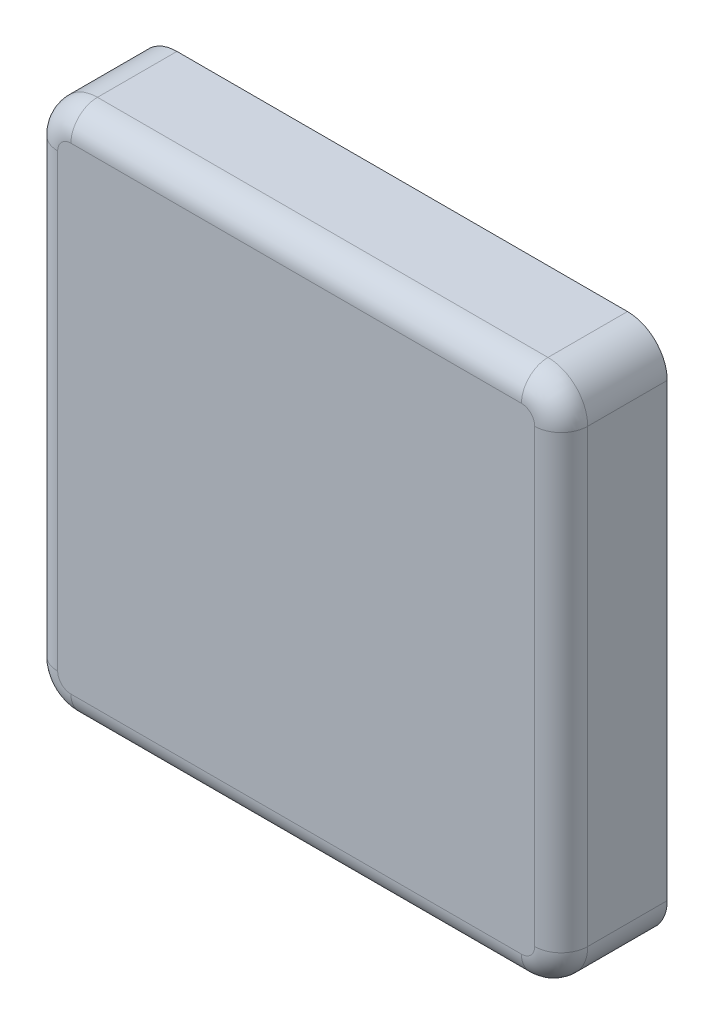
ISO-10303-21;
HEADER;
FILE_DESCRIPTION(('STEP AP214'),'2;1');
FILE_NAME('part.step','',(''),(''),'','','');
FILE_SCHEMA(('AUTOMOTIVE_DESIGN { 1 0 10303 214 1 1 1 1 }'));
ENDSEC;
DATA;
#1=APPLICATION_CONTEXT('core data for automotive mechanical design processes');
#2=APPLICATION_PROTOCOL_DEFINITION('international standard','automotive_design',2000,#1);
#3=PRODUCT_CONTEXT('',#1,'mechanical');
#4=PRODUCT('Part','Part','',(#3));
#5=PRODUCT_RELATED_PRODUCT_CATEGORY('part','',(#4));
#6=PRODUCT_DEFINITION_FORMATION('','',#4);
#7=PRODUCT_DEFINITION_CONTEXT('part definition',#1,'design');
#8=PRODUCT_DEFINITION('design','',#6,#7);
#9=PRODUCT_DEFINITION_SHAPE('','',#8);
#10=(LENGTH_UNIT() NAMED_UNIT(*) SI_UNIT(.MILLI.,.METRE.));
#11=(NAMED_UNIT(*) PLANE_ANGLE_UNIT() SI_UNIT($,.RADIAN.));
#12=(NAMED_UNIT(*) SI_UNIT($,.STERADIAN.) SOLID_ANGLE_UNIT());
#13=UNCERTAINTY_MEASURE_WITH_UNIT(LENGTH_MEASURE(1.E-05),#10,'distance_accuracy_value','');
#14=(GEOMETRIC_REPRESENTATION_CONTEXT(3) GLOBAL_UNCERTAINTY_ASSIGNED_CONTEXT((#13)) GLOBAL_UNIT_ASSIGNED_CONTEXT((#10,
#11,#12)) REPRESENTATION_CONTEXT('',''));
#15=CARTESIAN_POINT('',(0.,0.,0.));
#16=DIRECTION('',(0.,0.,1.));
#17=DIRECTION('',(1.,0.,0.));
#18=AXIS2_PLACEMENT_3D('',#15,#16,#17);
#19=CARTESIAN_POINT('',(0.,0.,0.));
#20=DIRECTION('',(0.,0.,1.));
#21=DIRECTION('',(1.,0.,0.));
#22=AXIS2_PLACEMENT_3D('',#19,#20,#21);
#23=PLANE('',#22);
#24=CARTESIAN_POINT('',(0.,0.,0.));
#25=DIRECTION('',(0.,0.,1.));
#26=DIRECTION('',(1.,0.,0.));
#27=AXIS2_PLACEMENT_3D('',#24,#25,#26);
#28=CIRCLE('',#27,4.5);
#29=CARTESIAN_POINT('',(4.5,0.,0.));
#30=VERTEX_POINT('',#29);
#31=EDGE_CURVE('E399',#30,#30,#28,.T.);
#32=ORIENTED_EDGE('',*,*,#31,.F.);
#33=EDGE_LOOP('',(#32));
#34=FACE_BOUND('',#33,.T.);
#35=DIRECTION('',(0.,1.,0.));
#36=VECTOR('',#35,1.);
#37=CARTESIAN_POINT('',(1.6,-1.6,0.));
#38=LINE('',#37,#36);
#39=CARTESIAN_POINT('',(1.6,-1.6,0.));
#40=VERTEX_POINT('',#39);
#41=CARTESIAN_POINT('',(1.6,1.6,0.));
#42=VERTEX_POINT('',#41);
#43=EDGE_CURVE('E353',#40,#42,#38,.T.);
#44=ORIENTED_EDGE('',*,*,#43,.T.);
#45=DIRECTION('',(-1.,0.,0.));
#46=VECTOR('',#45,1.);
#47=CARTESIAN_POINT('',(-1.6,1.6,0.));
#48=LINE('',#47,#46);
#49=CARTESIAN_POINT('',(-1.6,1.6,0.));
#50=VERTEX_POINT('',#49);
#51=EDGE_CURVE('E375',#42,#50,#48,.T.);
#52=ORIENTED_EDGE('',*,*,#51,.T.);
#53=DIRECTION('',(0.,-1.,0.));
#54=VECTOR('',#53,1.);
#55=CARTESIAN_POINT('',(-1.6,-1.6,0.));
#56=LINE('',#55,#54);
#57=CARTESIAN_POINT('',(-1.6,-1.6,0.));
#58=VERTEX_POINT('',#57);
#59=EDGE_CURVE('E379',#50,#58,#56,.T.);
#60=ORIENTED_EDGE('',*,*,#59,.T.);
#61=DIRECTION('',(1.,0.,0.));
#62=VECTOR('',#61,1.);
#63=CARTESIAN_POINT('',(-1.6,-1.6,0.));
#64=LINE('',#63,#62);
#65=EDGE_CURVE('E359',#58,#40,#64,.T.);
#66=ORIENTED_EDGE('',*,*,#65,.T.);
#67=EDGE_LOOP('',(#44,#52,#60,#66));
#68=FACE_BOUND('',#67,.T.);
#69=ADVANCED_FACE('F39',(#34,#68),#23,.F.);
#70=CARTESIAN_POINT('',(0.,0.,5.1));
#71=DIRECTION('',(0.,0.,-1.));
#72=DIRECTION('',(-1.,0.,0.));
#73=AXIS2_PLACEMENT_3D('',#70,#71,#72);
#74=CYLINDRICAL_SURFACE('',#73,4.5);
#75=CARTESIAN_POINT('',(0.,0.,5.1));
#76=DIRECTION('',(0.,0.,1.));
#77=DIRECTION('',(1.,0.,0.));
#78=AXIS2_PLACEMENT_3D('',#75,#76,#77);
#79=CIRCLE('',#78,4.5);
#80=CARTESIAN_POINT('',(4.5,0.,5.1));
#81=VERTEX_POINT('',#80);
#82=EDGE_CURVE('E400',#81,#81,#79,.T.);
#83=ORIENTED_EDGE('',*,*,#82,.F.);
#84=EDGE_LOOP('',(#83));
#85=FACE_BOUND('',#84,.T.);
#86=ORIENTED_EDGE('',*,*,#31,.T.);
#87=EDGE_LOOP('',(#86));
#88=FACE_BOUND('',#87,.T.);
#89=ADVANCED_FACE('F544',(#85,#88),#74,.T.);
#90=CARTESIAN_POINT('',(1.6,-1.6,5.1));
#91=DIRECTION('',(-1.,0.,0.));
#92=DIRECTION('',(0.,0.,1.));
#93=AXIS2_PLACEMENT_3D('',#90,#91,#92);
#94=PLANE('',#93);
#95=ORIENTED_EDGE('',*,*,#43,.F.);
#96=DIRECTION('',(0.,0.,-1.));
#97=VECTOR('',#96,1.);
#98=CARTESIAN_POINT('',(1.6,-1.6,5.1));
#99=LINE('',#98,#97);
#100=CARTESIAN_POINT('',(1.6,-1.6,5.1));
#101=VERTEX_POINT('',#100);
#102=EDGE_CURVE('E371',#101,#40,#99,.T.);
#103=ORIENTED_EDGE('',*,*,#102,.F.);
#104=DIRECTION('',(0.,1.,0.));
#105=VECTOR('',#104,1.);
#106=CARTESIAN_POINT('',(1.6,-1.6,5.1));
#107=LINE('',#106,#105);
#108=CARTESIAN_POINT('',(1.6,1.6,5.1));
#109=VERTEX_POINT('',#108);
#110=EDGE_CURVE('E354',#101,#109,#107,.T.);
#111=ORIENTED_EDGE('',*,*,#110,.T.);
#112=DIRECTION('',(0.,0.,-1.));
#113=VECTOR('',#112,1.);
#114=CARTESIAN_POINT('',(1.6,1.6,5.1));
#115=LINE('',#114,#113);
#116=EDGE_CURVE('E395',#109,#42,#115,.T.);
#117=ORIENTED_EDGE('',*,*,#116,.T.);
#118=EDGE_LOOP('',(#95,#103,#111,#117));
#119=FACE_BOUND('',#118,.T.);
#120=ADVANCED_FACE('F550',(#119),#94,.T.);
#121=CARTESIAN_POINT('',(-1.6,1.6,5.1));
#122=DIRECTION('',(0.,-1.,0.));
#123=DIRECTION('',(0.,0.,-1.));
#124=AXIS2_PLACEMENT_3D('',#121,#122,#123);
#125=PLANE('',#124);
#126=ORIENTED_EDGE('',*,*,#51,.F.);
#127=ORIENTED_EDGE('',*,*,#116,.F.);
#128=DIRECTION('',(-1.,0.,0.));
#129=VECTOR('',#128,1.);
#130=CARTESIAN_POINT('',(-1.6,1.6,5.1));
#131=LINE('',#130,#129);
#132=CARTESIAN_POINT('',(-1.6,1.6,5.1));
#133=VERTEX_POINT('',#132);
#134=EDGE_CURVE('E358',#109,#133,#131,.T.);
#135=ORIENTED_EDGE('',*,*,#134,.T.);
#136=DIRECTION('',(0.,0.,-1.));
#137=VECTOR('',#136,1.);
#138=CARTESIAN_POINT('',(-1.6,1.6,5.1));
#139=LINE('',#138,#137);
#140=EDGE_CURVE('E392',#133,#50,#139,.T.);
#141=ORIENTED_EDGE('',*,*,#140,.T.);
#142=EDGE_LOOP('',(#126,#127,#135,#141));
#143=FACE_BOUND('',#142,.T.);
#144=ADVANCED_FACE('F595',(#143),#125,.T.);
#145=CARTESIAN_POINT('',(-1.6,-1.6,5.1));
#146=DIRECTION('',(1.,0.,0.));
#147=DIRECTION('',(0.,0.,-1.));
#148=AXIS2_PLACEMENT_3D('',#145,#146,#147);
#149=PLANE('',#148);
#150=ORIENTED_EDGE('',*,*,#59,.F.);
#151=ORIENTED_EDGE('',*,*,#140,.F.);
#152=DIRECTION('',(0.,-1.,0.));
#153=VECTOR('',#152,1.);
#154=CARTESIAN_POINT('',(-1.6,-1.6,5.1));
#155=LINE('',#154,#153);
#156=CARTESIAN_POINT('',(-1.6,-1.6,5.1));
#157=VERTEX_POINT('',#156);
#158=EDGE_CURVE('E363',#133,#157,#155,.T.);
#159=ORIENTED_EDGE('',*,*,#158,.T.);
#160=DIRECTION('',(0.,0.,-1.));
#161=VECTOR('',#160,1.);
#162=CARTESIAN_POINT('',(-1.6,-1.6,5.1));
#163=LINE('',#162,#161);
#164=EDGE_CURVE('E389',#157,#58,#163,.T.);
#165=ORIENTED_EDGE('',*,*,#164,.T.);
#166=EDGE_LOOP('',(#150,#151,#159,#165));
#167=FACE_BOUND('',#166,.T.);
#168=ADVANCED_FACE('F592',(#167),#149,.T.);
#169=CARTESIAN_POINT('',(-1.6,-1.6,5.1));
#170=DIRECTION('',(0.,1.,0.));
#171=DIRECTION('',(0.,0.,1.));
#172=AXIS2_PLACEMENT_3D('',#169,#170,#171);
#173=PLANE('',#172);
#174=ORIENTED_EDGE('',*,*,#65,.F.);
#175=ORIENTED_EDGE('',*,*,#164,.F.);
#176=DIRECTION('',(1.,0.,0.));
#177=VECTOR('',#176,1.);
#178=CARTESIAN_POINT('',(-1.6,-1.6,5.1));
#179=LINE('',#178,#177);
#180=EDGE_CURVE('E367',#157,#101,#179,.T.);
#181=ORIENTED_EDGE('',*,*,#180,.T.);
#182=ORIENTED_EDGE('',*,*,#102,.T.);
#183=EDGE_LOOP('',(#174,#175,#181,#182));
#184=FACE_BOUND('',#183,.T.);
#185=ADVANCED_FACE('F588',(#184),#173,.T.);
#186=CARTESIAN_POINT('',(8.5,-8.5,5.1));
#187=DIRECTION('',(0.,0.,1.));
#188=DIRECTION('',(1.,0.,0.));
#189=AXIS2_PLACEMENT_3D('',#186,#187,#188);
#190=PLANE('',#189);
#191=ORIENTED_EDGE('',*,*,#134,.F.);
#192=ORIENTED_EDGE('',*,*,#110,.F.);
#193=ORIENTED_EDGE('',*,*,#180,.F.);
#194=ORIENTED_EDGE('',*,*,#158,.F.);
#195=EDGE_LOOP('',(#191,#192,#193,#194));
#196=FACE_BOUND('',#195,.T.);
#197=ADVANCED_FACE('F591',(#196),#190,.F.);
#198=DIRECTION('',(0.,1.,0.));
#199=VECTOR('',#198,1.);
#200=CARTESIAN_POINT('',(-9.,-8.5,5.1));
#201=LINE('',#200,#199);
#202=CARTESIAN_POINT('',(-9.,-8.5,5.1));
#203=VERTEX_POINT('',#202);
#204=CARTESIAN_POINT('',(-9.,8.49999999999999,5.1));
#205=VERTEX_POINT('',#204);
#206=EDGE_CURVE('E215',#203,#205,#201,.T.);
#207=ORIENTED_EDGE('',*,*,#206,.T.);
#208=CARTESIAN_POINT('',(-8.5,8.5,5.1));
#209=DIRECTION('',(0.,0.,-1.));
#210=DIRECTION('',(-1.,0.,0.));
#211=AXIS2_PLACEMENT_3D('',#208,#209,#210);
#212=CIRCLE('',#211,0.5);
#213=CARTESIAN_POINT('',(-8.49999999999999,9.,5.1));
#214=VERTEX_POINT('',#213);
#215=EDGE_CURVE('E251',#205,#214,#212,.T.);
#216=ORIENTED_EDGE('',*,*,#215,.T.);
#217=DIRECTION('',(1.,0.,0.));
#218=VECTOR('',#217,1.);
#219=CARTESIAN_POINT('',(-8.49999999999999,9.,5.1));
#220=LINE('',#219,#218);
#221=CARTESIAN_POINT('',(8.49999999999999,9.,5.1));
#222=VERTEX_POINT('',#221);
#223=EDGE_CURVE('E221',#214,#222,#220,.T.);
#224=ORIENTED_EDGE('',*,*,#223,.T.);
#225=CARTESIAN_POINT('',(8.5,8.5,5.1));
#226=DIRECTION('',(0.,0.,-1.));
#227=DIRECTION('',(-1.,0.,0.));
#228=AXIS2_PLACEMENT_3D('',#225,#226,#227);
#229=CIRCLE('',#228,0.5);
#230=CARTESIAN_POINT('',(9.,8.5,5.1));
#231=VERTEX_POINT('',#230);
#232=EDGE_CURVE('E256',#222,#231,#229,.T.);
#233=ORIENTED_EDGE('',*,*,#232,.T.);
#234=DIRECTION('',(0.,-1.,0.));
#235=VECTOR('',#234,1.);
#236=CARTESIAN_POINT('',(9.,8.5,5.1));
#237=LINE('',#236,#235);
#238=CARTESIAN_POINT('',(9.,-8.49999999999999,5.1));
#239=VERTEX_POINT('',#238);
#240=EDGE_CURVE('E260',#231,#239,#237,.T.);
#241=ORIENTED_EDGE('',*,*,#240,.T.);
#242=CARTESIAN_POINT('',(8.5,-8.5,5.1));
#243=DIRECTION('',(0.,0.,-1.));
#244=DIRECTION('',(-1.,0.,0.));
#245=AXIS2_PLACEMENT_3D('',#242,#243,#244);
#246=CIRCLE('',#245,0.5);
#247=CARTESIAN_POINT('',(8.5,-9.,5.1));
#248=VERTEX_POINT('',#247);
#249=EDGE_CURVE('E264',#239,#248,#246,.T.);
#250=ORIENTED_EDGE('',*,*,#249,.T.);
#251=DIRECTION('',(-1.,0.,0.));
#252=VECTOR('',#251,1.);
#253=CARTESIAN_POINT('',(8.5,-9.,5.1));
#254=LINE('',#253,#252);
#255=CARTESIAN_POINT('',(-8.49999999999999,-9.,5.1));
#256=VERTEX_POINT('',#255);
#257=EDGE_CURVE('E268',#248,#256,#254,.T.);
#258=ORIENTED_EDGE('',*,*,#257,.T.);
#259=CARTESIAN_POINT('',(-8.5,-8.5,5.1));
#260=DIRECTION('',(0.,0.,-1.));
#261=DIRECTION('',(-1.,0.,0.));
#262=AXIS2_PLACEMENT_3D('',#259,#260,#261);
#263=CIRCLE('',#262,0.5);
#264=EDGE_CURVE('E272',#256,#203,#263,.T.);
#265=ORIENTED_EDGE('',*,*,#264,.T.);
#266=EDGE_LOOP('',(#207,#216,#224,#233,#241,#250,#258,#265));
#267=FACE_BOUND('',#266,.T.);
#268=ORIENTED_EDGE('',*,*,#82,.T.);
#269=EDGE_LOOP('',(#268));
#270=FACE_BOUND('',#269,.T.);
#271=ADVANCED_FACE('F611',(#267,#270),#190,.F.);
#272=CARTESIAN_POINT('',(8.5,-8.5,2.1));
#273=DIRECTION('',(0.,0.,-1.));
#274=DIRECTION('',(-1.,0.,0.));
#275=AXIS2_PLACEMENT_3D('',#272,#273,#274);
#276=PLANE('',#275);
#277=CARTESIAN_POINT('',(8.5,-8.5,2.1));
#278=DIRECTION('',(0.,0.,-1.));
#279=DIRECTION('',(-1.,0.,0.));
#280=AXIS2_PLACEMENT_3D('',#277,#278,#279);
#281=CIRCLE('',#280,1.5);
#282=CARTESIAN_POINT('',(10.,-8.49999999999999,2.1));
#283=VERTEX_POINT('',#282);
#284=CARTESIAN_POINT('',(8.49999999999999,-10.,2.1));
#285=VERTEX_POINT('',#284);
#286=EDGE_CURVE('E223',#283,#285,#281,.T.);
#287=ORIENTED_EDGE('',*,*,#286,.T.);
#288=DIRECTION('',(-1.,0.,0.));
#289=VECTOR('',#288,1.);
#290=CARTESIAN_POINT('',(8.49999999999999,-10.,2.1));
#291=LINE('',#290,#289);
#292=CARTESIAN_POINT('',(-8.49999999999999,-10.,2.1));
#293=VERTEX_POINT('',#292);
#294=EDGE_CURVE('E301',#285,#293,#291,.T.);
#295=ORIENTED_EDGE('',*,*,#294,.T.);
#296=CARTESIAN_POINT('',(-8.5,-8.5,2.1));
#297=DIRECTION('',(0.,0.,-1.));
#298=DIRECTION('',(-1.,0.,0.));
#299=AXIS2_PLACEMENT_3D('',#296,#297,#298);
#300=CIRCLE('',#299,1.5);
#301=CARTESIAN_POINT('',(-10.,-8.5,2.1));
#302=VERTEX_POINT('',#301);
#303=EDGE_CURVE('E305',#293,#302,#300,.T.);
#304=ORIENTED_EDGE('',*,*,#303,.T.);
#305=DIRECTION('',(0.,1.,0.));
#306=VECTOR('',#305,1.);
#307=CARTESIAN_POINT('',(-10.,-8.5,2.1));
#308=LINE('',#307,#306);
#309=CARTESIAN_POINT('',(-10.,8.49999999999999,2.1));
#310=VERTEX_POINT('',#309);
#311=EDGE_CURVE('E309',#302,#310,#308,.T.);
#312=ORIENTED_EDGE('',*,*,#311,.T.);
#313=CARTESIAN_POINT('',(-8.5,8.5,2.1));
#314=DIRECTION('',(0.,0.,-1.));
#315=DIRECTION('',(-1.,0.,0.));
#316=AXIS2_PLACEMENT_3D('',#313,#314,#315);
#317=CIRCLE('',#316,1.5);
#318=CARTESIAN_POINT('',(-8.49999999999999,10.,2.1));
#319=VERTEX_POINT('',#318);
#320=EDGE_CURVE('E313',#310,#319,#317,.T.);
#321=ORIENTED_EDGE('',*,*,#320,.T.);
#322=DIRECTION('',(1.,0.,0.));
#323=VECTOR('',#322,1.);
#324=CARTESIAN_POINT('',(-8.49999999999999,10.,2.1));
#325=LINE('',#324,#323);
#326=CARTESIAN_POINT('',(8.49999999999999,10.,2.1));
#327=VERTEX_POINT('',#326);
#328=EDGE_CURVE('E317',#319,#327,#325,.T.);
#329=ORIENTED_EDGE('',*,*,#328,.T.);
#330=CARTESIAN_POINT('',(8.5,8.5,2.1));
#331=DIRECTION('',(0.,0.,-1.));
#332=DIRECTION('',(-1.,0.,0.));
#333=AXIS2_PLACEMENT_3D('',#330,#331,#332);
#334=CIRCLE('',#333,1.5);
#335=CARTESIAN_POINT('',(10.,8.49999999999999,2.1));
#336=VERTEX_POINT('',#335);
#337=EDGE_CURVE('E321',#327,#336,#334,.T.);
#338=ORIENTED_EDGE('',*,*,#337,.T.);
#339=DIRECTION('',(0.,-1.,0.));
#340=VECTOR('',#339,1.);
#341=CARTESIAN_POINT('',(10.,8.49999999999999,2.1));
#342=LINE('',#341,#340);
#343=EDGE_CURVE('E325',#336,#283,#342,.T.);
#344=ORIENTED_EDGE('',*,*,#343,.T.);
#345=EDGE_LOOP('',(#287,#295,#304,#312,#321,#329,#338,#344));
#346=FACE_BOUND('',#345,.T.);
#347=DIRECTION('',(1.,0.,0.));
#348=VECTOR('',#347,1.);
#349=CARTESIAN_POINT('',(-8.49999999999999,9.,2.1));
#350=LINE('',#349,#348);
#351=CARTESIAN_POINT('',(-8.49999999999999,9.,2.1));
#352=VERTEX_POINT('',#351);
#353=CARTESIAN_POINT('',(8.49999999999999,9.,2.1));
#354=VERTEX_POINT('',#353);
#355=EDGE_CURVE('E214',#352,#354,#350,.T.);
#356=ORIENTED_EDGE('',*,*,#355,.F.);
#357=CARTESIAN_POINT('',(-8.5,8.5,2.1));
#358=DIRECTION('',(0.,0.,-1.));
#359=DIRECTION('',(-1.,0.,0.));
#360=AXIS2_PLACEMENT_3D('',#357,#358,#359);
#361=CIRCLE('',#360,0.5);
#362=CARTESIAN_POINT('',(-9.,8.49999999999999,2.1));
#363=VERTEX_POINT('',#362);
#364=EDGE_CURVE('E203',#363,#352,#361,.T.);
#365=ORIENTED_EDGE('',*,*,#364,.F.);
#366=DIRECTION('',(0.,1.,0.));
#367=VECTOR('',#366,1.);
#368=CARTESIAN_POINT('',(-9.,-8.5,2.1));
#369=LINE('',#368,#367);
#370=CARTESIAN_POINT('',(-9.,-8.5,2.1));
#371=VERTEX_POINT('',#370);
#372=EDGE_CURVE('E248',#371,#363,#369,.T.);
#373=ORIENTED_EDGE('',*,*,#372,.F.);
#374=CARTESIAN_POINT('',(-8.5,-8.5,2.1));
#375=DIRECTION('',(0.,0.,-1.));
#376=DIRECTION('',(-1.,0.,0.));
#377=AXIS2_PLACEMENT_3D('',#374,#375,#376);
#378=CIRCLE('',#377,0.5);
#379=CARTESIAN_POINT('',(-8.49999999999999,-9.,2.1));
#380=VERTEX_POINT('',#379);
#381=EDGE_CURVE('E244',#380,#371,#378,.T.);
#382=ORIENTED_EDGE('',*,*,#381,.F.);
#383=DIRECTION('',(-1.,0.,0.));
#384=VECTOR('',#383,1.);
#385=CARTESIAN_POINT('',(8.5,-9.,2.1));
#386=LINE('',#385,#384);
#387=CARTESIAN_POINT('',(8.5,-9.,2.1));
#388=VERTEX_POINT('',#387);
#389=EDGE_CURVE('E241',#388,#380,#386,.T.);
#390=ORIENTED_EDGE('',*,*,#389,.F.);
#391=CARTESIAN_POINT('',(8.5,-8.5,2.1));
#392=DIRECTION('',(0.,0.,-1.));
#393=DIRECTION('',(-1.,0.,0.));
#394=AXIS2_PLACEMENT_3D('',#391,#392,#393);
#395=CIRCLE('',#394,0.5);
#396=CARTESIAN_POINT('',(9.,-8.49999999999999,2.1));
#397=VERTEX_POINT('',#396);
#398=EDGE_CURVE('E238',#397,#388,#395,.T.);
#399=ORIENTED_EDGE('',*,*,#398,.F.);
#400=DIRECTION('',(0.,-1.,0.));
#401=VECTOR('',#400,1.);
#402=CARTESIAN_POINT('',(9.,8.5,2.1));
#403=LINE('',#402,#401);
#404=CARTESIAN_POINT('',(9.,8.5,2.1));
#405=VERTEX_POINT('',#404);
#406=EDGE_CURVE('E233',#405,#397,#403,.T.);
#407=ORIENTED_EDGE('',*,*,#406,.F.);
#408=CARTESIAN_POINT('',(8.5,8.5,2.1));
#409=DIRECTION('',(0.,0.,-1.));
#410=DIRECTION('',(-1.,0.,0.));
#411=AXIS2_PLACEMENT_3D('',#408,#409,#410);
#412=CIRCLE('',#411,0.5);
#413=EDGE_CURVE('E229',#354,#405,#412,.T.);
#414=ORIENTED_EDGE('',*,*,#413,.F.);
#415=EDGE_LOOP('',(#356,#365,#373,#382,#390,#399,#407,#414));
#416=FACE_BOUND('',#415,.T.);
#417=ADVANCED_FACE('F227',(#346,#416),#276,.T.);
#418=CARTESIAN_POINT('',(-8.5,8.5,2.1));
#419=DIRECTION('',(0.,0.,1.));
#420=DIRECTION('',(1.,0.,0.));
#421=AXIS2_PLACEMENT_3D('',#418,#419,#420);
#422=CYLINDRICAL_SURFACE('',#421,0.5);
#423=ORIENTED_EDGE('',*,*,#215,.F.);
#424=DIRECTION('',(0.,0.,1.));
#425=VECTOR('',#424,1.);
#426=CARTESIAN_POINT('',(-9.,8.49999999999999,2.1));
#427=LINE('',#426,#425);
#428=EDGE_CURVE('E209',#363,#205,#427,.T.);
#429=ORIENTED_EDGE('',*,*,#428,.F.);
#430=ORIENTED_EDGE('',*,*,#364,.T.);
#431=DIRECTION('',(0.,0.,1.));
#432=VECTOR('',#431,1.);
#433=CARTESIAN_POINT('',(-8.49999999999999,9.,2.1));
#434=LINE('',#433,#432);
#435=EDGE_CURVE('E207',#352,#214,#434,.T.);
#436=ORIENTED_EDGE('',*,*,#435,.T.);
#437=EDGE_LOOP('',(#423,#429,#430,#436));
#438=FACE_BOUND('',#437,.T.);
#439=ADVANCED_FACE('F206',(#438),#422,.F.);
#440=CARTESIAN_POINT('',(-8.49999999999999,9.,2.1));
#441=DIRECTION('',(0.,-1.,0.));
#442=DIRECTION('',(0.,0.,-1.));
#443=AXIS2_PLACEMENT_3D('',#440,#441,#442);
#444=PLANE('',#443);
#445=ORIENTED_EDGE('',*,*,#223,.F.);
#446=ORIENTED_EDGE('',*,*,#435,.F.);
#447=ORIENTED_EDGE('',*,*,#355,.T.);
#448=DIRECTION('',(0.,0.,1.));
#449=VECTOR('',#448,1.);
#450=CARTESIAN_POINT('',(8.49999999999999,9.,2.1));
#451=LINE('',#450,#449);
#452=EDGE_CURVE('E224',#354,#222,#451,.T.);
#453=ORIENTED_EDGE('',*,*,#452,.T.);
#454=EDGE_LOOP('',(#445,#446,#447,#453));
#455=FACE_BOUND('',#454,.T.);
#456=ADVANCED_FACE('F218',(#455),#444,.T.);
#457=CARTESIAN_POINT('',(8.5,8.5,2.1));
#458=DIRECTION('',(0.,0.,1.));
#459=DIRECTION('',(1.,0.,0.));
#460=AXIS2_PLACEMENT_3D('',#457,#458,#459);
#461=CYLINDRICAL_SURFACE('',#460,0.5);
#462=ORIENTED_EDGE('',*,*,#232,.F.);
#463=ORIENTED_EDGE('',*,*,#452,.F.);
#464=ORIENTED_EDGE('',*,*,#413,.T.);
#465=DIRECTION('',(0.,0.,1.));
#466=VECTOR('',#465,1.);
#467=CARTESIAN_POINT('',(9.,8.5,2.1));
#468=LINE('',#467,#466);
#469=EDGE_CURVE('E293',#405,#231,#468,.T.);
#470=ORIENTED_EDGE('',*,*,#469,.T.);
#471=EDGE_LOOP('',(#462,#463,#464,#470));
#472=FACE_BOUND('',#471,.T.);
#473=ADVANCED_FACE('F770',(#472),#461,.F.);
#474=CARTESIAN_POINT('',(9.,8.5,2.1));
#475=DIRECTION('',(-1.,0.,0.));
#476=DIRECTION('',(0.,0.,1.));
#477=AXIS2_PLACEMENT_3D('',#474,#475,#476);
#478=PLANE('',#477);
#479=ORIENTED_EDGE('',*,*,#240,.F.);
#480=ORIENTED_EDGE('',*,*,#469,.F.);
#481=ORIENTED_EDGE('',*,*,#406,.T.);
#482=DIRECTION('',(0.,0.,1.));
#483=VECTOR('',#482,1.);
#484=CARTESIAN_POINT('',(9.,-8.49999999999999,2.1));
#485=LINE('',#484,#483);
#486=EDGE_CURVE('E290',#397,#239,#485,.T.);
#487=ORIENTED_EDGE('',*,*,#486,.T.);
#488=EDGE_LOOP('',(#479,#480,#481,#487));
#489=FACE_BOUND('',#488,.T.);
#490=ADVANCED_FACE('F778',(#489),#478,.T.);
#491=CARTESIAN_POINT('',(8.5,-8.5,2.1));
#492=DIRECTION('',(0.,0.,1.));
#493=DIRECTION('',(1.,0.,0.));
#494=AXIS2_PLACEMENT_3D('',#491,#492,#493);
#495=CYLINDRICAL_SURFACE('',#494,0.5);
#496=ORIENTED_EDGE('',*,*,#249,.F.);
#497=ORIENTED_EDGE('',*,*,#486,.F.);
#498=ORIENTED_EDGE('',*,*,#398,.T.);
#499=DIRECTION('',(0.,0.,1.));
#500=VECTOR('',#499,1.);
#501=CARTESIAN_POINT('',(8.5,-9.,2.1));
#502=LINE('',#501,#500);
#503=EDGE_CURVE('E287',#388,#248,#502,.T.);
#504=ORIENTED_EDGE('',*,*,#503,.T.);
#505=EDGE_LOOP('',(#496,#497,#498,#504));
#506=FACE_BOUND('',#505,.T.);
#507=ADVANCED_FACE('F787',(#506),#495,.F.);
#508=CARTESIAN_POINT('',(8.5,-9.,2.1));
#509=DIRECTION('',(0.,1.,0.));
#510=DIRECTION('',(0.,0.,1.));
#511=AXIS2_PLACEMENT_3D('',#508,#509,#510);
#512=PLANE('',#511);
#513=ORIENTED_EDGE('',*,*,#257,.F.);
#514=ORIENTED_EDGE('',*,*,#503,.F.);
#515=ORIENTED_EDGE('',*,*,#389,.T.);
#516=DIRECTION('',(0.,0.,1.));
#517=VECTOR('',#516,1.);
#518=CARTESIAN_POINT('',(-8.49999999999999,-9.,2.1));
#519=LINE('',#518,#517);
#520=EDGE_CURVE('E284',#380,#256,#519,.T.);
#521=ORIENTED_EDGE('',*,*,#520,.T.);
#522=EDGE_LOOP('',(#513,#514,#515,#521));
#523=FACE_BOUND('',#522,.T.);
#524=ADVANCED_FACE('F796',(#523),#512,.T.);
#525=CARTESIAN_POINT('',(-8.5,-8.5,2.1));
#526=DIRECTION('',(0.,0.,1.));
#527=DIRECTION('',(1.,0.,0.));
#528=AXIS2_PLACEMENT_3D('',#525,#526,#527);
#529=CYLINDRICAL_SURFACE('',#528,0.5);
#530=ORIENTED_EDGE('',*,*,#264,.F.);
#531=ORIENTED_EDGE('',*,*,#520,.F.);
#532=ORIENTED_EDGE('',*,*,#381,.T.);
#533=DIRECTION('',(0.,0.,1.));
#534=VECTOR('',#533,1.);
#535=CARTESIAN_POINT('',(-9.,-8.5,2.1));
#536=LINE('',#535,#534);
#537=EDGE_CURVE('E281',#371,#203,#536,.T.);
#538=ORIENTED_EDGE('',*,*,#537,.T.);
#539=EDGE_LOOP('',(#530,#531,#532,#538));
#540=FACE_BOUND('',#539,.T.);
#541=ADVANCED_FACE('F805',(#540),#529,.F.);
#542=CARTESIAN_POINT('',(-9.,-8.5,2.1));
#543=DIRECTION('',(1.,0.,0.));
#544=DIRECTION('',(0.,0.,-1.));
#545=AXIS2_PLACEMENT_3D('',#542,#543,#544);
#546=PLANE('',#545);
#547=ORIENTED_EDGE('',*,*,#206,.F.);
#548=ORIENTED_EDGE('',*,*,#537,.F.);
#549=ORIENTED_EDGE('',*,*,#372,.T.);
#550=ORIENTED_EDGE('',*,*,#428,.T.);
#551=EDGE_LOOP('',(#547,#548,#549,#550));
#552=FACE_BOUND('',#551,.T.);
#553=ADVANCED_FACE('F748',(#552),#546,.T.);
#554=CARTESIAN_POINT('',(8.5,-8.5,6.1));
#555=DIRECTION('',(0.,0.,1.));
#556=DIRECTION('',(1.,0.,0.));
#557=AXIS2_PLACEMENT_3D('',#554,#555,#556);
#558=PLANE('',#557);
#559=CARTESIAN_POINT('',(-8.5,-8.5,6.1));
#560=DIRECTION('',(0.,0.,1.));
#561=DIRECTION('',(1.,0.,0.));
#562=AXIS2_PLACEMENT_3D('',#559,#560,#561);
#563=CIRCLE('',#562,0.5);
#564=CARTESIAN_POINT('',(-9.,-8.5,6.1));
#565=VERTEX_POINT('',#564);
#566=CARTESIAN_POINT('',(-8.49999999999999,-9.,6.1));
#567=VERTEX_POINT('',#566);
#568=EDGE_CURVE('E425',#565,#567,#563,.T.);
#569=ORIENTED_EDGE('',*,*,#568,.T.);
#570=DIRECTION('',(1.,0.,0.));
#571=VECTOR('',#570,1.);
#572=CARTESIAN_POINT('',(8.49999999999999,-9.,6.1));
#573=LINE('',#572,#571);
#574=CARTESIAN_POINT('',(8.49999999999999,-9.,6.1));
#575=VERTEX_POINT('',#574);
#576=EDGE_CURVE('E428',#567,#575,#573,.T.);
#577=ORIENTED_EDGE('',*,*,#576,.T.);
#578=CARTESIAN_POINT('',(8.5,-8.5,6.1));
#579=DIRECTION('',(0.,0.,1.));
#580=DIRECTION('',(1.,0.,0.));
#581=AXIS2_PLACEMENT_3D('',#578,#579,#580);
#582=CIRCLE('',#581,0.5);
#583=CARTESIAN_POINT('',(9.,-8.49999999999999,6.1));
#584=VERTEX_POINT('',#583);
#585=EDGE_CURVE('E404',#575,#584,#582,.T.);
#586=ORIENTED_EDGE('',*,*,#585,.T.);
#587=DIRECTION('',(0.,1.,0.));
#588=VECTOR('',#587,1.);
#589=CARTESIAN_POINT('',(9.,8.49999999999999,6.1));
#590=LINE('',#589,#588);
#591=CARTESIAN_POINT('',(9.,8.5,6.1));
#592=VERTEX_POINT('',#591);
#593=EDGE_CURVE('E410',#584,#592,#590,.T.);
#594=ORIENTED_EDGE('',*,*,#593,.T.);
#595=CARTESIAN_POINT('',(8.5,8.5,6.1));
#596=DIRECTION('',(0.,0.,1.));
#597=DIRECTION('',(1.,0.,0.));
#598=AXIS2_PLACEMENT_3D('',#595,#596,#597);
#599=CIRCLE('',#598,0.5);
#600=CARTESIAN_POINT('',(8.49999999999999,9.,6.1));
#601=VERTEX_POINT('',#600);
#602=EDGE_CURVE('E413',#592,#601,#599,.T.);
#603=ORIENTED_EDGE('',*,*,#602,.T.);
#604=DIRECTION('',(-1.,0.,0.));
#605=VECTOR('',#604,1.);
#606=CARTESIAN_POINT('',(-8.49999999999999,9.,6.1));
#607=LINE('',#606,#605);
#608=CARTESIAN_POINT('',(-8.5,9.,6.1));
#609=VERTEX_POINT('',#608);
#610=EDGE_CURVE('E416',#601,#609,#607,.T.);
#611=ORIENTED_EDGE('',*,*,#610,.T.);
#612=CARTESIAN_POINT('',(-8.5,8.5,6.1));
#613=DIRECTION('',(0.,0.,1.));
#614=DIRECTION('',(1.,0.,0.));
#615=AXIS2_PLACEMENT_3D('',#612,#613,#614);
#616=CIRCLE('',#615,0.5);
#617=CARTESIAN_POINT('',(-9.,8.49999999999999,6.1));
#618=VERTEX_POINT('',#617);
#619=EDGE_CURVE('E419',#609,#618,#616,.T.);
#620=ORIENTED_EDGE('',*,*,#619,.T.);
#621=DIRECTION('',(0.,-1.,0.));
#622=VECTOR('',#621,1.);
#623=CARTESIAN_POINT('',(-9.,-8.5,6.1));
#624=LINE('',#623,#622);
#625=EDGE_CURVE('E422',#618,#565,#624,.T.);
#626=ORIENTED_EDGE('',*,*,#625,.T.);
#627=EDGE_LOOP('',(#569,#577,#586,#594,#603,#611,#620,#626));
#628=FACE_BOUND('',#627,.T.);
#629=ADVANCED_FACE('F619',(#628),#558,.T.);
#630=CARTESIAN_POINT('',(-8.49999999999999,-10.,6.1));
#631=DIRECTION('',(0.,1.,0.));
#632=DIRECTION('',(0.,0.,1.));
#633=AXIS2_PLACEMENT_3D('',#630,#631,#632);
#634=PLANE('',#633);
#635=DIRECTION('',(0.,0.,-1.));
#636=VECTOR('',#635,1.);
#637=CARTESIAN_POINT('',(8.49999999999999,-10.,6.1));
#638=LINE('',#637,#636);
#639=CARTESIAN_POINT('',(8.49999999999999,-10.,5.1));
#640=VERTEX_POINT('',#639);
#641=EDGE_CURVE('E329',#640,#285,#638,.T.);
#642=ORIENTED_EDGE('',*,*,#641,.F.);
#643=DIRECTION('',(1.,0.,0.));
#644=VECTOR('',#643,1.);
#645=CARTESIAN_POINT('',(-8.49999999999999,-10.,5.1));
#646=LINE('',#645,#644);
#647=CARTESIAN_POINT('',(-8.49999999999999,-10.,5.1));
#648=VERTEX_POINT('',#647);
#649=EDGE_CURVE('E432',#640,#648,#646,.F.);
#650=ORIENTED_EDGE('',*,*,#649,.T.);
#651=DIRECTION('',(0.,0.,-1.));
#652=VECTOR('',#651,1.);
#653=CARTESIAN_POINT('',(-8.49999999999999,-10.,6.1));
#654=LINE('',#653,#652);
#655=EDGE_CURVE('E332',#648,#293,#654,.T.);
#656=ORIENTED_EDGE('',*,*,#655,.T.);
#657=ORIENTED_EDGE('',*,*,#294,.F.);
#658=EDGE_LOOP('',(#642,#650,#656,#657));
#659=FACE_BOUND('',#658,.T.);
#660=ADVANCED_FACE('F521',(#659),#634,.F.);
#661=CARTESIAN_POINT('',(-8.5,-8.5,6.1));
#662=DIRECTION('',(0.,0.,-1.));
#663=DIRECTION('',(-1.,0.,0.));
#664=AXIS2_PLACEMENT_3D('',#661,#662,#663);
#665=CYLINDRICAL_SURFACE('',#664,1.5);
#666=ORIENTED_EDGE('',*,*,#655,.F.);
#667=CARTESIAN_POINT('',(-8.5,-8.5,5.1));
#668=DIRECTION('',(0.,0.,1.));
#669=DIRECTION('',(1.,0.,0.));
#670=AXIS2_PLACEMENT_3D('',#667,#668,#669);
#671=CIRCLE('',#670,1.5);
#672=CARTESIAN_POINT('',(-10.,-8.5,5.1));
#673=VERTEX_POINT('',#672);
#674=EDGE_CURVE('E436',#648,#673,#671,.F.);
#675=ORIENTED_EDGE('',*,*,#674,.T.);
#676=DIRECTION('',(0.,0.,-1.));
#677=VECTOR('',#676,1.);
#678=CARTESIAN_POINT('',(-10.,-8.5,6.1));
#679=LINE('',#678,#677);
#680=EDGE_CURVE('E335',#673,#302,#679,.T.);
#681=ORIENTED_EDGE('',*,*,#680,.T.);
#682=ORIENTED_EDGE('',*,*,#303,.F.);
#683=EDGE_LOOP('',(#666,#675,#681,#682));
#684=FACE_BOUND('',#683,.T.);
#685=ADVANCED_FACE('F525',(#684),#665,.T.);
#686=CARTESIAN_POINT('',(-10.,-8.49999999999999,6.1));
#687=DIRECTION('',(1.,0.,0.));
#688=DIRECTION('',(0.,0.,-1.));
#689=AXIS2_PLACEMENT_3D('',#686,#687,#688);
#690=PLANE('',#689);
#691=ORIENTED_EDGE('',*,*,#680,.F.);
#692=DIRECTION('',(0.,-1.,0.));
#693=VECTOR('',#692,1.);
#694=CARTESIAN_POINT('',(-10.,8.49999999999999,5.1));
#695=LINE('',#694,#693);
#696=CARTESIAN_POINT('',(-10.,8.49999999999999,5.1));
#697=VERTEX_POINT('',#696);
#698=EDGE_CURVE('E439',#673,#697,#695,.F.);
#699=ORIENTED_EDGE('',*,*,#698,.T.);
#700=DIRECTION('',(0.,0.,-1.));
#701=VECTOR('',#700,1.);
#702=CARTESIAN_POINT('',(-10.,8.49999999999999,6.1));
#703=LINE('',#702,#701);
#704=EDGE_CURVE('E338',#697,#310,#703,.T.);
#705=ORIENTED_EDGE('',*,*,#704,.T.);
#706=ORIENTED_EDGE('',*,*,#311,.F.);
#707=EDGE_LOOP('',(#691,#699,#705,#706));
#708=FACE_BOUND('',#707,.T.);
#709=ADVANCED_FACE('F530',(#708),#690,.F.);
#710=CARTESIAN_POINT('',(-8.5,8.5,6.1));
#711=DIRECTION('',(0.,0.,-1.));
#712=DIRECTION('',(-1.,0.,0.));
#713=AXIS2_PLACEMENT_3D('',#710,#711,#712);
#714=CYLINDRICAL_SURFACE('',#713,1.5);
#715=ORIENTED_EDGE('',*,*,#704,.F.);
#716=CARTESIAN_POINT('',(-8.5,8.5,5.1));
#717=DIRECTION('',(0.,0.,1.));
#718=DIRECTION('',(1.,0.,0.));
#719=AXIS2_PLACEMENT_3D('',#716,#717,#718);
#720=CIRCLE('',#719,1.5);
#721=CARTESIAN_POINT('',(-8.49999999999999,10.,5.1));
#722=VERTEX_POINT('',#721);
#723=EDGE_CURVE('E442',#697,#722,#720,.F.);
#724=ORIENTED_EDGE('',*,*,#723,.T.);
#725=DIRECTION('',(0.,0.,-1.));
#726=VECTOR('',#725,1.);
#727=CARTESIAN_POINT('',(-8.49999999999999,10.,6.1));
#728=LINE('',#727,#726);
#729=EDGE_CURVE('E341',#722,#319,#728,.T.);
#730=ORIENTED_EDGE('',*,*,#729,.T.);
#731=ORIENTED_EDGE('',*,*,#320,.F.);
#732=EDGE_LOOP('',(#715,#724,#730,#731));
#733=FACE_BOUND('',#732,.T.);
#734=ADVANCED_FACE('F534',(#733),#714,.T.);
#735=CARTESIAN_POINT('',(-8.49999999999999,10.,6.1));
#736=DIRECTION('',(0.,-1.,0.));
#737=DIRECTION('',(0.,0.,-1.));
#738=AXIS2_PLACEMENT_3D('',#735,#736,#737);
#739=PLANE('',#738);
#740=ORIENTED_EDGE('',*,*,#729,.F.);
#741=DIRECTION('',(-1.,0.,0.));
#742=VECTOR('',#741,1.);
#743=CARTESIAN_POINT('',(8.49999999999999,10.,5.1));
#744=LINE('',#743,#742);
#745=CARTESIAN_POINT('',(8.49999999999999,10.,5.1));
#746=VERTEX_POINT('',#745);
#747=EDGE_CURVE('E445',#722,#746,#744,.F.);
#748=ORIENTED_EDGE('',*,*,#747,.T.);
#749=DIRECTION('',(0.,0.,-1.));
#750=VECTOR('',#749,1.);
#751=CARTESIAN_POINT('',(8.49999999999999,10.,6.1));
#752=LINE('',#751,#750);
#753=EDGE_CURVE('E344',#746,#327,#752,.T.);
#754=ORIENTED_EDGE('',*,*,#753,.T.);
#755=ORIENTED_EDGE('',*,*,#328,.F.);
#756=EDGE_LOOP('',(#740,#748,#754,#755));
#757=FACE_BOUND('',#756,.T.);
#758=ADVANCED_FACE('F492',(#757),#739,.F.);
#759=CARTESIAN_POINT('',(8.5,8.5,6.1));
#760=DIRECTION('',(0.,0.,-1.));
#761=DIRECTION('',(-1.,0.,0.));
#762=AXIS2_PLACEMENT_3D('',#759,#760,#761);
#763=CYLINDRICAL_SURFACE('',#762,1.5);
#764=ORIENTED_EDGE('',*,*,#753,.F.);
#765=CARTESIAN_POINT('',(8.5,8.5,5.1));
#766=DIRECTION('',(0.,0.,1.));
#767=DIRECTION('',(1.,0.,0.));
#768=AXIS2_PLACEMENT_3D('',#765,#766,#767);
#769=CIRCLE('',#768,1.5);
#770=CARTESIAN_POINT('',(10.,8.49999999999999,5.1));
#771=VERTEX_POINT('',#770);
#772=EDGE_CURVE('E64',#746,#771,#769,.F.);
#773=ORIENTED_EDGE('',*,*,#772,.T.);
#774=DIRECTION('',(0.,0.,-1.));
#775=VECTOR('',#774,1.);
#776=CARTESIAN_POINT('',(10.,8.49999999999999,6.1));
#777=LINE('',#776,#775);
#778=EDGE_CURVE('E347',#771,#336,#777,.T.);
#779=ORIENTED_EDGE('',*,*,#778,.T.);
#780=ORIENTED_EDGE('',*,*,#337,.F.);
#781=EDGE_LOOP('',(#764,#773,#779,#780));
#782=FACE_BOUND('',#781,.T.);
#783=ADVANCED_FACE('F495',(#782),#763,.T.);
#784=CARTESIAN_POINT('',(10.,-8.49999999999999,6.1));
#785=DIRECTION('',(-1.,0.,0.));
#786=DIRECTION('',(0.,0.,1.));
#787=AXIS2_PLACEMENT_3D('',#784,#785,#786);
#788=PLANE('',#787);
#789=ORIENTED_EDGE('',*,*,#778,.F.);
#790=DIRECTION('',(0.,1.,0.));
#791=VECTOR('',#790,1.);
#792=CARTESIAN_POINT('',(10.,-8.49999999999999,5.1));
#793=LINE('',#792,#791);
#794=CARTESIAN_POINT('',(10.,-8.49999999999999,5.1));
#795=VERTEX_POINT('',#794);
#796=EDGE_CURVE('E49',#771,#795,#793,.F.);
#797=ORIENTED_EDGE('',*,*,#796,.T.);
#798=DIRECTION('',(0.,0.,-1.));
#799=VECTOR('',#798,1.);
#800=CARTESIAN_POINT('',(10.,-8.49999999999999,6.1));
#801=LINE('',#800,#799);
#802=EDGE_CURVE('E350',#795,#283,#801,.T.);
#803=ORIENTED_EDGE('',*,*,#802,.T.);
#804=ORIENTED_EDGE('',*,*,#343,.F.);
#805=EDGE_LOOP('',(#789,#797,#803,#804));
#806=FACE_BOUND('',#805,.T.);
#807=ADVANCED_FACE('F499',(#806),#788,.F.);
#808=CARTESIAN_POINT('',(8.5,-8.5,6.1));
#809=DIRECTION('',(0.,0.,-1.));
#810=DIRECTION('',(-1.,0.,0.));
#811=AXIS2_PLACEMENT_3D('',#808,#809,#810);
#812=CYLINDRICAL_SURFACE('',#811,1.5);
#813=ORIENTED_EDGE('',*,*,#802,.F.);
#814=CARTESIAN_POINT('',(8.5,-8.5,5.1));
#815=DIRECTION('',(0.,0.,1.));
#816=DIRECTION('',(1.,0.,0.));
#817=AXIS2_PLACEMENT_3D('',#814,#815,#816);
#818=CIRCLE('',#817,1.5);
#819=EDGE_CURVE('E11',#795,#640,#818,.F.);
#820=ORIENTED_EDGE('',*,*,#819,.T.);
#821=ORIENTED_EDGE('',*,*,#641,.T.);
#822=ORIENTED_EDGE('',*,*,#286,.F.);
#823=EDGE_LOOP('',(#813,#820,#821,#822));
#824=FACE_BOUND('',#823,.T.);
#825=ADVANCED_FACE('F503',(#824),#812,.T.);
#826=CARTESIAN_POINT('',(8.5,9.,5.1));
#827=DIRECTION('',(1.,0.,0.));
#828=DIRECTION('',(0.,0.,-1.));
#829=AXIS2_PLACEMENT_3D('',#826,#827,#828);
#830=CYLINDRICAL_SURFACE('',#829,1.);
#831=CARTESIAN_POINT('',(8.49999999999999,9.,5.1));
#832=DIRECTION('',(1.,0.,0.));
#833=DIRECTION('',(0.,0.,-1.));
#834=AXIS2_PLACEMENT_3D('',#831,#832,#833);
#835=CIRCLE('',#834,1.);
#836=EDGE_CURVE('E473',#746,#601,#835,.T.);
#837=ORIENTED_EDGE('',*,*,#836,.F.);
#838=ORIENTED_EDGE('',*,*,#747,.F.);
#839=CARTESIAN_POINT('',(-8.5,9.,5.1));
#840=DIRECTION('',(-1.,0.,0.));
#841=DIRECTION('',(0.,-1.,0.));
#842=AXIS2_PLACEMENT_3D('',#839,#840,#841);
#843=CIRCLE('',#842,1.);
#844=EDGE_CURVE('E43',#609,#722,#843,.T.);
#845=ORIENTED_EDGE('',*,*,#844,.F.);
#846=ORIENTED_EDGE('',*,*,#610,.F.);
#847=EDGE_LOOP('',(#837,#838,#845,#846));
#848=FACE_BOUND('',#847,.T.);
#849=ADVANCED_FACE('F41',(#848),#830,.T.);
#850=CARTESIAN_POINT('',(-8.5,8.5,5.1));
#851=DIRECTION('',(0.,0.,1.));
#852=DIRECTION('',(1.,0.,0.));
#853=AXIS2_PLACEMENT_3D('',#850,#851,#852);
#854=DEGENERATE_TOROIDAL_SURFACE('',#853,0.5,1.,.T.);
#855=ORIENTED_EDGE('',*,*,#844,.T.);
#856=ORIENTED_EDGE('',*,*,#723,.F.);
#857=CARTESIAN_POINT('',(-9.,8.49999999999999,5.1));
#858=DIRECTION('',(0.,-1.,0.));
#859=DIRECTION('',(0.,0.,-1.));
#860=AXIS2_PLACEMENT_3D('',#857,#858,#859);
#861=CIRCLE('',#860,1.);
#862=EDGE_CURVE('E470',#618,#697,#861,.T.);
#863=ORIENTED_EDGE('',*,*,#862,.F.);
#864=ORIENTED_EDGE('',*,*,#619,.F.);
#865=EDGE_LOOP('',(#855,#856,#863,#864));
#866=FACE_BOUND('',#865,.T.);
#867=ADVANCED_FACE('F485',(#866),#854,.T.);
#868=CARTESIAN_POINT('',(8.5,8.5,5.1));
#869=DIRECTION('',(0.,0.,1.));
#870=DIRECTION('',(1.,0.,0.));
#871=AXIS2_PLACEMENT_3D('',#868,#869,#870);
#872=DEGENERATE_TOROIDAL_SURFACE('',#871,0.5,1.,.T.);
#873=ORIENTED_EDGE('',*,*,#836,.T.);
#874=ORIENTED_EDGE('',*,*,#602,.F.);
#875=CARTESIAN_POINT('',(9.,8.5,5.1));
#876=DIRECTION('',(0.,-1.,0.));
#877=DIRECTION('',(1.,0.,0.));
#878=AXIS2_PLACEMENT_3D('',#875,#876,#877);
#879=CIRCLE('',#878,1.);
#880=EDGE_CURVE('E466',#771,#592,#879,.T.);
#881=ORIENTED_EDGE('',*,*,#880,.F.);
#882=ORIENTED_EDGE('',*,*,#772,.F.);
#883=EDGE_LOOP('',(#873,#874,#881,#882));
#884=FACE_BOUND('',#883,.T.);
#885=ADVANCED_FACE('F571',(#884),#872,.T.);
#886=CARTESIAN_POINT('',(-9.,-8.5,5.1));
#887=DIRECTION('',(0.,1.,0.));
#888=DIRECTION('',(0.,0.,1.));
#889=AXIS2_PLACEMENT_3D('',#886,#887,#888);
#890=CYLINDRICAL_SURFACE('',#889,1.);
#891=ORIENTED_EDGE('',*,*,#862,.T.);
#892=ORIENTED_EDGE('',*,*,#698,.F.);
#893=CARTESIAN_POINT('',(-9.,-8.5,5.1));
#894=DIRECTION('',(0.,-1.,0.));
#895=DIRECTION('',(0.,0.,-1.));
#896=AXIS2_PLACEMENT_3D('',#893,#894,#895);
#897=CIRCLE('',#896,1.);
#898=EDGE_CURVE('E462',#565,#673,#897,.T.);
#899=ORIENTED_EDGE('',*,*,#898,.F.);
#900=ORIENTED_EDGE('',*,*,#625,.F.);
#901=EDGE_LOOP('',(#891,#892,#899,#900));
#902=FACE_BOUND('',#901,.T.);
#903=ADVANCED_FACE('F568',(#902),#890,.T.);
#904=CARTESIAN_POINT('',(9.,-8.5,5.1));
#905=DIRECTION('',(0.,-1.,0.));
#906=DIRECTION('',(0.,0.,-1.));
#907=AXIS2_PLACEMENT_3D('',#904,#905,#906);
#908=CYLINDRICAL_SURFACE('',#907,1.);
#909=ORIENTED_EDGE('',*,*,#880,.T.);
#910=ORIENTED_EDGE('',*,*,#593,.F.);
#911=CARTESIAN_POINT('',(9.,-8.49999999999999,5.1));
#912=DIRECTION('',(0.,-1.,0.));
#913=DIRECTION('',(0.,0.,-1.));
#914=AXIS2_PLACEMENT_3D('',#911,#912,#913);
#915=CIRCLE('',#914,1.);
#916=EDGE_CURVE('E458',#795,#584,#915,.T.);
#917=ORIENTED_EDGE('',*,*,#916,.F.);
#918=ORIENTED_EDGE('',*,*,#796,.F.);
#919=EDGE_LOOP('',(#909,#910,#917,#918));
#920=FACE_BOUND('',#919,.T.);
#921=ADVANCED_FACE('F508',(#920),#908,.T.);
#922=CARTESIAN_POINT('',(-8.5,-8.5,5.1));
#923=DIRECTION('',(0.,0.,1.));
#924=DIRECTION('',(1.,0.,0.));
#925=AXIS2_PLACEMENT_3D('',#922,#923,#924);
#926=DEGENERATE_TOROIDAL_SURFACE('',#925,0.5,1.,.T.);
#927=ORIENTED_EDGE('',*,*,#898,.T.);
#928=ORIENTED_EDGE('',*,*,#674,.F.);
#929=CARTESIAN_POINT('',(-8.49999999999999,-9.,5.1));
#930=DIRECTION('',(1.,0.,0.));
#931=DIRECTION('',(0.,0.,-1.));
#932=AXIS2_PLACEMENT_3D('',#929,#930,#931);
#933=CIRCLE('',#932,1.);
#934=EDGE_CURVE('E455',#567,#648,#933,.T.);
#935=ORIENTED_EDGE('',*,*,#934,.F.);
#936=ORIENTED_EDGE('',*,*,#568,.F.);
#937=EDGE_LOOP('',(#927,#928,#935,#936));
#938=FACE_BOUND('',#937,.T.);
#939=ADVANCED_FACE('F562',(#938),#926,.T.);
#940=CARTESIAN_POINT('',(8.5,-8.5,5.1));
#941=DIRECTION('',(0.,0.,1.));
#942=DIRECTION('',(1.,0.,0.));
#943=AXIS2_PLACEMENT_3D('',#940,#941,#942);
#944=DEGENERATE_TOROIDAL_SURFACE('',#943,0.5,1.,.T.);
#945=ORIENTED_EDGE('',*,*,#916,.T.);
#946=ORIENTED_EDGE('',*,*,#585,.F.);
#947=CARTESIAN_POINT('',(8.5,-9.,5.1));
#948=DIRECTION('',(-1.,0.,0.));
#949=DIRECTION('',(0.,-1.,0.));
#950=AXIS2_PLACEMENT_3D('',#947,#948,#949);
#951=CIRCLE('',#950,1.);
#952=EDGE_CURVE('E452',#640,#575,#951,.T.);
#953=ORIENTED_EDGE('',*,*,#952,.F.);
#954=ORIENTED_EDGE('',*,*,#819,.F.);
#955=EDGE_LOOP('',(#945,#946,#953,#954));
#956=FACE_BOUND('',#955,.T.);
#957=ADVANCED_FACE('F512',(#956),#944,.T.);
#958=CARTESIAN_POINT('',(8.5,-9.,5.1));
#959=DIRECTION('',(-1.,0.,0.));
#960=DIRECTION('',(0.,0.,1.));
#961=AXIS2_PLACEMENT_3D('',#958,#959,#960);
#962=CYLINDRICAL_SURFACE('',#961,1.);
#963=ORIENTED_EDGE('',*,*,#934,.T.);
#964=ORIENTED_EDGE('',*,*,#649,.F.);
#965=ORIENTED_EDGE('',*,*,#952,.T.);
#966=ORIENTED_EDGE('',*,*,#576,.F.);
#967=EDGE_LOOP('',(#963,#964,#965,#966));
#968=FACE_BOUND('',#967,.T.);
#969=ADVANCED_FACE('F516',(#968),#962,.T.);
#970=CLOSED_SHELL('',(#69,#89,#120,#144,#168,#185,#197,#271,#417,#439,#456,#473,#490,#507,#524,
#541,#553,#629,#660,#685,#709,#734,#758,#783,#807,#825,#849,#867,#885,#903,#921,#939,#957,#969));
#971=MANIFOLD_SOLID_BREP('B2',#970);
#972=ADVANCED_BREP_SHAPE_REPRESENTATION('',(#18,#971),#14);
#973=SHAPE_DEFINITION_REPRESENTATION(#9,#972);
ENDSEC;
END-ISO-10303-21;
